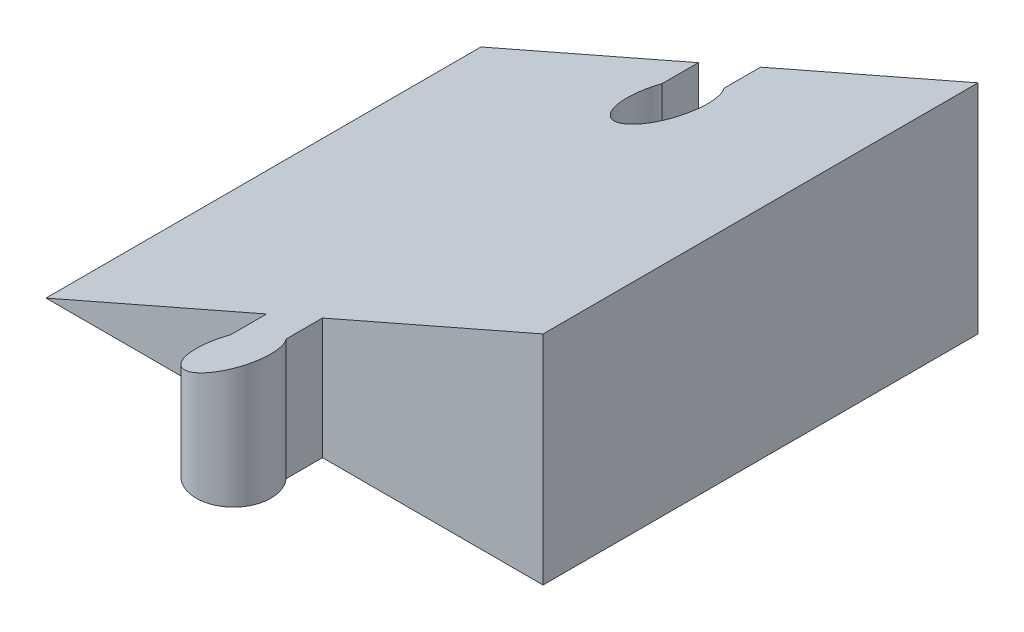
ISO-10303-21;
HEADER;
FILE_DESCRIPTION(('STEP AP214'),'2;1');
FILE_NAME('part.step','',(''),(''),'','','');
FILE_SCHEMA(('AUTOMOTIVE_DESIGN { 1 0 10303 214 1 1 1 1 }'));
ENDSEC;
DATA;
#1=APPLICATION_CONTEXT('core data for automotive mechanical design processes');
#2=APPLICATION_PROTOCOL_DEFINITION('international standard','automotive_design',2000,#1);
#3=PRODUCT_CONTEXT('',#1,'mechanical');
#4=PRODUCT('Part','Part','',(#3));
#5=PRODUCT_RELATED_PRODUCT_CATEGORY('part','',(#4));
#6=PRODUCT_DEFINITION_FORMATION('','',#4);
#7=PRODUCT_DEFINITION_CONTEXT('part definition',#1,'design');
#8=PRODUCT_DEFINITION('design','',#6,#7);
#9=PRODUCT_DEFINITION_SHAPE('','',#8);
#10=(LENGTH_UNIT() NAMED_UNIT(*) SI_UNIT(.MILLI.,.METRE.));
#11=(NAMED_UNIT(*) PLANE_ANGLE_UNIT() SI_UNIT($,.RADIAN.));
#12=(NAMED_UNIT(*) SI_UNIT($,.STERADIAN.) SOLID_ANGLE_UNIT());
#13=UNCERTAINTY_MEASURE_WITH_UNIT(LENGTH_MEASURE(1.E-05),#10,'distance_accuracy_value','');
#14=(GEOMETRIC_REPRESENTATION_CONTEXT(3) GLOBAL_UNCERTAINTY_ASSIGNED_CONTEXT((#13)) GLOBAL_UNIT_ASSIGNED_CONTEXT((#10,
#11,#12)) REPRESENTATION_CONTEXT('',''));
#15=CARTESIAN_POINT('',(0.,0.,0.));
#16=DIRECTION('',(0.,0.,1.));
#17=DIRECTION('',(1.,0.,0.));
#18=AXIS2_PLACEMENT_3D('',#15,#16,#17);
#19=CARTESIAN_POINT('',(0.,0.,0.));
#20=DIRECTION('',(0.,0.,1.));
#21=DIRECTION('',(1.,0.,0.));
#22=AXIS2_PLACEMENT_3D('',#19,#20,#21);
#23=PLANE('',#22);
#24=DIRECTION('',(-0.916157334902189,-0.400818834019708,0.));
#25=VECTOR('',#24,1.);
#26=CARTESIAN_POINT('',(-46.1666666666667,-15.6527777777778,0.));
#27=LINE('',#26,#25);
#28=CARTESIAN_POINT('',(-11.1666666666667,-0.34027777777778,0.));
#29=VERTEX_POINT('',#28);
#30=CARTESIAN_POINT('',(-46.1666666666667,-15.6527777777778,0.));
#31=VERTEX_POINT('',#30);
#32=EDGE_CURVE('E139',#29,#31,#27,.T.);
#33=ORIENTED_EDGE('',*,*,#32,.F.);
#34=DIRECTION('',(0.,-1.,0.));
#35=VECTOR('',#34,1.);
#36=CARTESIAN_POINT('',(-11.1666666666667,0.,0.));
#37=LINE('',#36,#35);
#38=CARTESIAN_POINT('',(-11.1666666666667,-15.6527777777778,0.));
#39=VERTEX_POINT('',#38);
#40=EDGE_CURVE('E11',#29,#39,#37,.T.);
#41=ORIENTED_EDGE('',*,*,#40,.T.);
#42=DIRECTION('',(1.,0.,0.));
#43=VECTOR('',#42,1.);
#44=CARTESIAN_POINT('',(-46.1666666666667,-15.6527777777778,0.));
#45=LINE('',#44,#43);
#46=EDGE_CURVE('E138',#31,#39,#45,.T.);
#47=ORIENTED_EDGE('',*,*,#46,.F.);
#48=EDGE_LOOP('',(#33,#41,#47));
#49=FACE_BOUND('',#48,.T.);
#50=ADVANCED_FACE('F39',(#49),#23,.F.);
#51=CARTESIAN_POINT('',(0.,0.,70.));
#52=DIRECTION('',(0.,0.,1.));
#53=DIRECTION('',(1.,0.,0.));
#54=AXIS2_PLACEMENT_3D('',#51,#52,#53);
#55=PLANE('',#54);
#56=DIRECTION('',(-0.916157334902189,-0.400818834019708,0.));
#57=VECTOR('',#56,1.);
#58=CARTESIAN_POINT('',(-46.1666666666667,-15.6527777777778,70.));
#59=LINE('',#58,#57);
#60=CARTESIAN_POINT('',(33.8333333333333,19.3472222222222,70.));
#61=VERTEX_POINT('',#60);
#62=CARTESIAN_POINT('',(-1.66666666666668,3.81597222222222,70.));
#63=VERTEX_POINT('',#62);
#64=EDGE_CURVE('E194',#61,#63,#59,.T.);
#65=ORIENTED_EDGE('',*,*,#64,.T.);
#66=DIRECTION('',(0.,-1.,0.));
#67=VECTOR('',#66,1.);
#68=CARTESIAN_POINT('',(-1.66666666666667,22.6081927879704,70.));
#69=LINE('',#68,#67);
#70=CARTESIAN_POINT('',(-1.66666666666667,-15.6527777777778,70.));
#71=VERTEX_POINT('',#70);
#72=EDGE_CURVE('E63',#63,#71,#69,.T.);
#73=ORIENTED_EDGE('',*,*,#72,.T.);
#74=DIRECTION('',(1.,0.,0.));
#75=VECTOR('',#74,1.);
#76=CARTESIAN_POINT('',(-46.1666666666667,-15.6527777777778,70.));
#77=LINE('',#76,#75);
#78=CARTESIAN_POINT('',(33.8333333333333,-15.6527777777778,70.));
#79=VERTEX_POINT('',#78);
#80=EDGE_CURVE('E193',#71,#79,#77,.T.);
#81=ORIENTED_EDGE('',*,*,#80,.T.);
#82=DIRECTION('',(0.,1.,0.));
#83=VECTOR('',#82,1.);
#84=CARTESIAN_POINT('',(33.8333333333333,19.3472222222222,70.));
#85=LINE('',#84,#83);
#86=EDGE_CURVE('E146',#79,#61,#85,.T.);
#87=ORIENTED_EDGE('',*,*,#86,.T.);
#88=EDGE_LOOP('',(#65,#73,#81,#87));
#89=FACE_BOUND('',#88,.T.);
#90=ADVANCED_FACE('F260',(#89),#55,.T.);
#91=CARTESIAN_POINT('',(33.8333333333333,19.3472222222222,70.));
#92=DIRECTION('',(-1.,0.,0.));
#93=DIRECTION('',(0.,0.,1.));
#94=AXIS2_PLACEMENT_3D('',#91,#92,#93);
#95=PLANE('',#94);
#96=DIRECTION('',(0.,1.,0.));
#97=VECTOR('',#96,1.);
#98=CARTESIAN_POINT('',(33.8333333333333,19.3472222222222,0.));
#99=LINE('',#98,#97);
#100=CARTESIAN_POINT('',(33.8333333333333,-15.6527777777778,0.));
#101=VERTEX_POINT('',#100);
#102=CARTESIAN_POINT('',(33.8333333333333,19.3472222222222,0.));
#103=VERTEX_POINT('',#102);
#104=EDGE_CURVE('E183',#101,#103,#99,.T.);
#105=ORIENTED_EDGE('',*,*,#104,.T.);
#106=DIRECTION('',(0.,0.,-1.));
#107=VECTOR('',#106,1.);
#108=CARTESIAN_POINT('',(33.8333333333333,19.3472222222222,70.));
#109=LINE('',#108,#107);
#110=EDGE_CURVE('E165',#61,#103,#109,.T.);
#111=ORIENTED_EDGE('',*,*,#110,.F.);
#112=ORIENTED_EDGE('',*,*,#86,.F.);
#113=DIRECTION('',(0.,0.,-1.));
#114=VECTOR('',#113,1.);
#115=CARTESIAN_POINT('',(33.8333333333333,-15.6527777777778,70.));
#116=LINE('',#115,#114);
#117=EDGE_CURVE('E158',#79,#101,#116,.T.);
#118=ORIENTED_EDGE('',*,*,#117,.T.);
#119=EDGE_LOOP('',(#105,#111,#112,#118));
#120=FACE_BOUND('',#119,.T.);
#121=ADVANCED_FACE('F41',(#120),#95,.F.);
#122=CARTESIAN_POINT('',(-46.1666666666667,-15.6527777777778,70.));
#123=DIRECTION('',(0.400818834019708,-0.916157334902189,0.));
#124=DIRECTION('',(0.916157334902189,0.400818834019708,0.));
#125=AXIS2_PLACEMENT_3D('',#122,#123,#124);
#126=PLANE('',#125);
#127=CARTESIAN_POINT('',(-6.16666666666667,1.84722222222222,10.));
#128=DIRECTION('',(0.400818834019708,-0.916157334902189,0.));
#129=DIRECTION('',(-0.916157334902189,-0.400818834019708,0.));
#130=AXIS2_PLACEMENT_3D('',#127,#128,#129);
#131=ELLIPSE('',#130,7.09485123610777,6.5);
#132=CARTESIAN_POINT('',(-1.16666666666667,4.03472222222222,5.84668806854096));
#133=VERTEX_POINT('',#132);
#134=CARTESIAN_POINT('',(-11.1666666666667,-0.34027777777778,5.84668806854096));
#135=VERTEX_POINT('',#134);
#136=EDGE_CURVE('E221',#133,#135,#131,.T.);
#137=ORIENTED_EDGE('',*,*,#136,.T.);
#138=DIRECTION('',(0.,0.,-1.));
#139=VECTOR('',#138,1.);
#140=CARTESIAN_POINT('',(-11.1666666666667,-0.340277777777787,70.));
#141=LINE('',#140,#139);
#142=EDGE_CURVE('E230',#135,#29,#141,.T.);
#143=ORIENTED_EDGE('',*,*,#142,.T.);
#144=ORIENTED_EDGE('',*,*,#32,.T.);
#145=DIRECTION('',(0.,0.,-1.));
#146=VECTOR('',#145,1.);
#147=CARTESIAN_POINT('',(-46.1666666666667,-15.6527777777778,70.));
#148=LINE('',#147,#146);
#149=CARTESIAN_POINT('',(-46.1666666666667,-15.6527777777778,70.));
#150=VERTEX_POINT('',#149);
#151=EDGE_CURVE('E144',#150,#31,#148,.T.);
#152=ORIENTED_EDGE('',*,*,#151,.F.);
#153=CARTESIAN_POINT('',(-10.6666666666667,-0.121527777777776,70.));
#154=VERTEX_POINT('',#153);
#155=EDGE_CURVE('E152',#154,#150,#59,.T.);
#156=ORIENTED_EDGE('',*,*,#155,.F.);
#157=DIRECTION('',(0.,0.,1.));
#158=VECTOR('',#157,1.);
#159=CARTESIAN_POINT('',(-10.6666666666667,-0.121527777777776,70.));
#160=LINE('',#159,#158);
#161=CARTESIAN_POINT('',(-10.6666666666667,-0.121527777777776,75.846688068541));
#162=VERTEX_POINT('',#161);
#163=EDGE_CURVE('E185',#154,#162,#160,.T.);
#164=ORIENTED_EDGE('',*,*,#163,.T.);
#165=CARTESIAN_POINT('',(-6.16666666666667,1.84722222222222,79.8153150351379));
#166=DIRECTION('',(0.400818834019708,-0.916157334902189,0.));
#167=DIRECTION('',(-0.916157334902189,-0.400818834019708,0.));
#168=AXIS2_PLACEMENT_3D('',#165,#166,#167);
#169=ELLIPSE('',#168,6.54909344871487,6.);
#170=CARTESIAN_POINT('',(-1.66666666666667,3.81597222222222,75.846688068541));
#171=VERTEX_POINT('',#170);
#172=EDGE_CURVE('E188',#162,#171,#169,.F.);
#173=ORIENTED_EDGE('',*,*,#172,.T.);
#174=DIRECTION('',(0.,0.,-1.));
#175=VECTOR('',#174,1.);
#176=CARTESIAN_POINT('',(-1.66666666666667,3.81597222222222,70.));
#177=LINE('',#176,#175);
#178=EDGE_CURVE('E210',#171,#63,#177,.T.);
#179=ORIENTED_EDGE('',*,*,#178,.T.);
#180=ORIENTED_EDGE('',*,*,#64,.F.);
#181=ORIENTED_EDGE('',*,*,#110,.T.);
#182=CARTESIAN_POINT('',(-1.16666666666668,4.03472222222222,0.));
#183=VERTEX_POINT('',#182);
#184=EDGE_CURVE('E154',#103,#183,#27,.T.);
#185=ORIENTED_EDGE('',*,*,#184,.T.);
#186=DIRECTION('',(0.,0.,1.));
#187=VECTOR('',#186,1.);
#188=CARTESIAN_POINT('',(-1.16666666666666,4.03472222222223,70.));
#189=LINE('',#188,#187);
#190=EDGE_CURVE('E55',#183,#133,#189,.T.);
#191=ORIENTED_EDGE('',*,*,#190,.T.);
#192=EDGE_LOOP('',(#137,#143,#144,#152,#156,#164,#173,#179,#180,#181,#185,#191));
#193=FACE_BOUND('',#192,.T.);
#194=ADVANCED_FACE('F178',(#193),#126,.F.);
#195=CARTESIAN_POINT('',(-46.1666666666667,-15.6527777777778,70.));
#196=DIRECTION('',(0.,1.,0.));
#197=DIRECTION('',(0.,0.,1.));
#198=AXIS2_PLACEMENT_3D('',#195,#196,#197);
#199=PLANE('',#198);
#200=ORIENTED_EDGE('',*,*,#46,.T.);
#201=DIRECTION('',(0.,0.,-1.));
#202=VECTOR('',#201,1.);
#203=CARTESIAN_POINT('',(-11.1666666666667,-15.6527777777778,0.));
#204=LINE('',#203,#202);
#205=CARTESIAN_POINT('',(-11.1666666666667,-15.6527777777778,5.84668806854096));
#206=VERTEX_POINT('',#205);
#207=EDGE_CURVE('E123',#206,#39,#204,.T.);
#208=ORIENTED_EDGE('',*,*,#207,.F.);
#209=CARTESIAN_POINT('',(-6.16666666666667,-15.6527777777778,10.));
#210=DIRECTION('',(0.,-1.,0.));
#211=DIRECTION('',(0.,0.,-1.));
#212=AXIS2_PLACEMENT_3D('',#209,#210,#211);
#213=CIRCLE('',#212,6.5);
#214=CARTESIAN_POINT('',(-1.16666666666667,-15.6527777777778,5.84668806854096));
#215=VERTEX_POINT('',#214);
#216=EDGE_CURVE('E238',#215,#206,#213,.T.);
#217=ORIENTED_EDGE('',*,*,#216,.F.);
#218=DIRECTION('',(0.,0.,1.));
#219=VECTOR('',#218,1.);
#220=CARTESIAN_POINT('',(-1.16666666666668,-15.6527777777778,0.));
#221=LINE('',#220,#219);
#222=CARTESIAN_POINT('',(-1.16666666666668,-15.6527777777778,0.));
#223=VERTEX_POINT('',#222);
#224=EDGE_CURVE('E133',#223,#215,#221,.T.);
#225=ORIENTED_EDGE('',*,*,#224,.F.);
#226=EDGE_CURVE('E147',#223,#101,#45,.T.);
#227=ORIENTED_EDGE('',*,*,#226,.T.);
#228=ORIENTED_EDGE('',*,*,#117,.F.);
#229=ORIENTED_EDGE('',*,*,#80,.F.);
#230=DIRECTION('',(0.,0.,1.));
#231=VECTOR('',#230,1.);
#232=CARTESIAN_POINT('',(-1.66666666666667,-15.6527777777778,70.));
#233=LINE('',#232,#231);
#234=CARTESIAN_POINT('',(-1.66666666666667,-15.6527777777778,75.846688068541));
#235=VERTEX_POINT('',#234);
#236=EDGE_CURVE('E214',#71,#235,#233,.T.);
#237=ORIENTED_EDGE('',*,*,#236,.T.);
#238=CARTESIAN_POINT('',(-6.16666666666667,-15.6527777777778,79.8153150351379));
#239=DIRECTION('',(0.,-1.,0.));
#240=DIRECTION('',(0.,0.,-1.));
#241=AXIS2_PLACEMENT_3D('',#238,#239,#240);
#242=CIRCLE('',#241,6.);
#243=CARTESIAN_POINT('',(-10.6666666666667,-15.6527777777778,75.846688068541));
#244=VERTEX_POINT('',#243);
#245=EDGE_CURVE('E201',#235,#244,#242,.T.);
#246=ORIENTED_EDGE('',*,*,#245,.T.);
#247=DIRECTION('',(0.,0.,-1.));
#248=VECTOR('',#247,1.);
#249=CARTESIAN_POINT('',(-10.6666666666667,-15.6527777777778,70.));
#250=LINE('',#249,#248);
#251=CARTESIAN_POINT('',(-10.6666666666667,-15.6527777777778,70.));
#252=VERTEX_POINT('',#251);
#253=EDGE_CURVE('E218',#244,#252,#250,.T.);
#254=ORIENTED_EDGE('',*,*,#253,.T.);
#255=EDGE_CURVE('E162',#150,#252,#77,.T.);
#256=ORIENTED_EDGE('',*,*,#255,.F.);
#257=ORIENTED_EDGE('',*,*,#151,.T.);
#258=EDGE_LOOP('',(#200,#208,#217,#225,#227,#228,#229,#237,#246,#254,#256,#257));
#259=FACE_BOUND('',#258,.T.);
#260=ADVANCED_FACE('F141',(#259),#199,.F.);
#261=DIRECTION('',(0.,-1.,0.));
#262=VECTOR('',#261,1.);
#263=CARTESIAN_POINT('',(-10.6666666666667,22.6081927879704,70.));
#264=LINE('',#263,#262);
#265=EDGE_CURVE('E197',#154,#252,#264,.T.);
#266=ORIENTED_EDGE('',*,*,#265,.F.);
#267=ORIENTED_EDGE('',*,*,#155,.T.);
#268=ORIENTED_EDGE('',*,*,#255,.T.);
#269=EDGE_LOOP('',(#266,#267,#268));
#270=FACE_BOUND('',#269,.T.);
#271=ADVANCED_FACE('F266',(#270),#55,.T.);
#272=ORIENTED_EDGE('',*,*,#226,.F.);
#273=DIRECTION('',(0.,1.,0.));
#274=VECTOR('',#273,1.);
#275=CARTESIAN_POINT('',(-1.16666666666668,0.,0.));
#276=LINE('',#275,#274);
#277=EDGE_CURVE('E48',#223,#183,#276,.T.);
#278=ORIENTED_EDGE('',*,*,#277,.T.);
#279=ORIENTED_EDGE('',*,*,#184,.F.);
#280=ORIENTED_EDGE('',*,*,#104,.F.);
#281=EDGE_LOOP('',(#272,#278,#279,#280));
#282=FACE_BOUND('',#281,.T.);
#283=ADVANCED_FACE('F172',(#282),#23,.F.);
#284=CARTESIAN_POINT('',(-10.6666666666667,22.6081927879704,70.));
#285=DIRECTION('',(-1.,0.,0.));
#286=DIRECTION('',(0.,0.,1.));
#287=AXIS2_PLACEMENT_3D('',#284,#285,#286);
#288=PLANE('',#287);
#289=ORIENTED_EDGE('',*,*,#163,.F.);
#290=ORIENTED_EDGE('',*,*,#265,.T.);
#291=ORIENTED_EDGE('',*,*,#253,.F.);
#292=DIRECTION('',(0.,-1.,0.));
#293=VECTOR('',#292,1.);
#294=CARTESIAN_POINT('',(-10.6666666666667,22.6081927879704,75.846688068541));
#295=LINE('',#294,#293);
#296=EDGE_CURVE('E207',#162,#244,#295,.T.);
#297=ORIENTED_EDGE('',*,*,#296,.F.);
#298=EDGE_LOOP('',(#289,#290,#291,#297));
#299=FACE_BOUND('',#298,.T.);
#300=ADVANCED_FACE('F269',(#299),#288,.T.);
#301=CARTESIAN_POINT('',(-6.16666666666667,22.6081927879704,79.8153150351379));
#302=DIRECTION('',(0.,-1.,0.));
#303=DIRECTION('',(0.,0.,-1.));
#304=AXIS2_PLACEMENT_3D('',#301,#302,#303);
#305=CYLINDRICAL_SURFACE('',#304,6.);
#306=ORIENTED_EDGE('',*,*,#172,.F.);
#307=ORIENTED_EDGE('',*,*,#296,.T.);
#308=ORIENTED_EDGE('',*,*,#245,.F.);
#309=DIRECTION('',(0.,-1.,0.));
#310=VECTOR('',#309,1.);
#311=CARTESIAN_POINT('',(-1.66666666666667,22.6081927879704,75.846688068541));
#312=LINE('',#311,#310);
#313=EDGE_CURVE('E204',#171,#235,#312,.T.);
#314=ORIENTED_EDGE('',*,*,#313,.F.);
#315=EDGE_LOOP('',(#306,#307,#308,#314));
#316=FACE_BOUND('',#315,.T.);
#317=ADVANCED_FACE('F255',(#316),#305,.T.);
#318=CARTESIAN_POINT('',(-1.66666666666667,22.6081927879704,70.));
#319=DIRECTION('',(1.,0.,0.));
#320=DIRECTION('',(0.,0.,-1.));
#321=AXIS2_PLACEMENT_3D('',#318,#319,#320);
#322=PLANE('',#321);
#323=ORIENTED_EDGE('',*,*,#178,.F.);
#324=ORIENTED_EDGE('',*,*,#313,.T.);
#325=ORIENTED_EDGE('',*,*,#236,.F.);
#326=ORIENTED_EDGE('',*,*,#72,.F.);
#327=EDGE_LOOP('',(#323,#324,#325,#326));
#328=FACE_BOUND('',#327,.T.);
#329=ADVANCED_FACE('F248',(#328),#322,.T.);
#330=CARTESIAN_POINT('',(-6.16666666666667,54.3472222222222,10.));
#331=DIRECTION('',(0.,-1.,0.));
#332=DIRECTION('',(0.,0.,-1.));
#333=AXIS2_PLACEMENT_3D('',#330,#331,#332);
#334=CYLINDRICAL_SURFACE('',#333,6.5);
#335=DIRECTION('',(0.,-1.,0.));
#336=VECTOR('',#335,1.);
#337=CARTESIAN_POINT('',(-1.16666666666667,54.3472222222222,5.84668806854096));
#338=LINE('',#337,#336);
#339=EDGE_CURVE('E235',#133,#215,#338,.T.);
#340=ORIENTED_EDGE('',*,*,#339,.T.);
#341=ORIENTED_EDGE('',*,*,#216,.T.);
#342=DIRECTION('',(0.,-1.,0.));
#343=VECTOR('',#342,1.);
#344=CARTESIAN_POINT('',(-11.1666666666667,54.3472222222222,5.84668806854096));
#345=LINE('',#344,#343);
#346=EDGE_CURVE('E127',#135,#206,#345,.T.);
#347=ORIENTED_EDGE('',*,*,#346,.F.);
#348=ORIENTED_EDGE('',*,*,#136,.F.);
#349=EDGE_LOOP('',(#340,#341,#347,#348));
#350=FACE_BOUND('',#349,.T.);
#351=ADVANCED_FACE('F246',(#350),#334,.F.);
#352=CARTESIAN_POINT('',(-11.1666666666667,54.3472222222222,0.));
#353=DIRECTION('',(-1.,0.,0.));
#354=DIRECTION('',(0.,0.,1.));
#355=AXIS2_PLACEMENT_3D('',#352,#353,#354);
#356=PLANE('',#355);
#357=ORIENTED_EDGE('',*,*,#346,.T.);
#358=ORIENTED_EDGE('',*,*,#207,.T.);
#359=ORIENTED_EDGE('',*,*,#40,.F.);
#360=ORIENTED_EDGE('',*,*,#142,.F.);
#361=EDGE_LOOP('',(#357,#358,#359,#360));
#362=FACE_BOUND('',#361,.T.);
#363=ADVANCED_FACE('F124',(#362),#356,.F.);
#364=CARTESIAN_POINT('',(-1.16666666666668,54.3472222222222,0.));
#365=DIRECTION('',(1.,0.,0.));
#366=DIRECTION('',(0.,0.,-1.));
#367=AXIS2_PLACEMENT_3D('',#364,#365,#366);
#368=PLANE('',#367);
#369=ORIENTED_EDGE('',*,*,#277,.F.);
#370=ORIENTED_EDGE('',*,*,#224,.T.);
#371=ORIENTED_EDGE('',*,*,#339,.F.);
#372=ORIENTED_EDGE('',*,*,#190,.F.);
#373=EDGE_LOOP('',(#369,#370,#371,#372));
#374=FACE_BOUND('',#373,.T.);
#375=ADVANCED_FACE('F244',(#374),#368,.F.);
#376=CLOSED_SHELL('',(#50,#90,#121,#194,#260,#271,#283,#300,#317,#329,#351,#363,#375));
#377=MANIFOLD_SOLID_BREP('B2',#376);
#378=ADVANCED_BREP_SHAPE_REPRESENTATION('',(#18,#377),#14);
#379=SHAPE_DEFINITION_REPRESENTATION(#9,#378);
ENDSEC;
END-ISO-10303-21;
